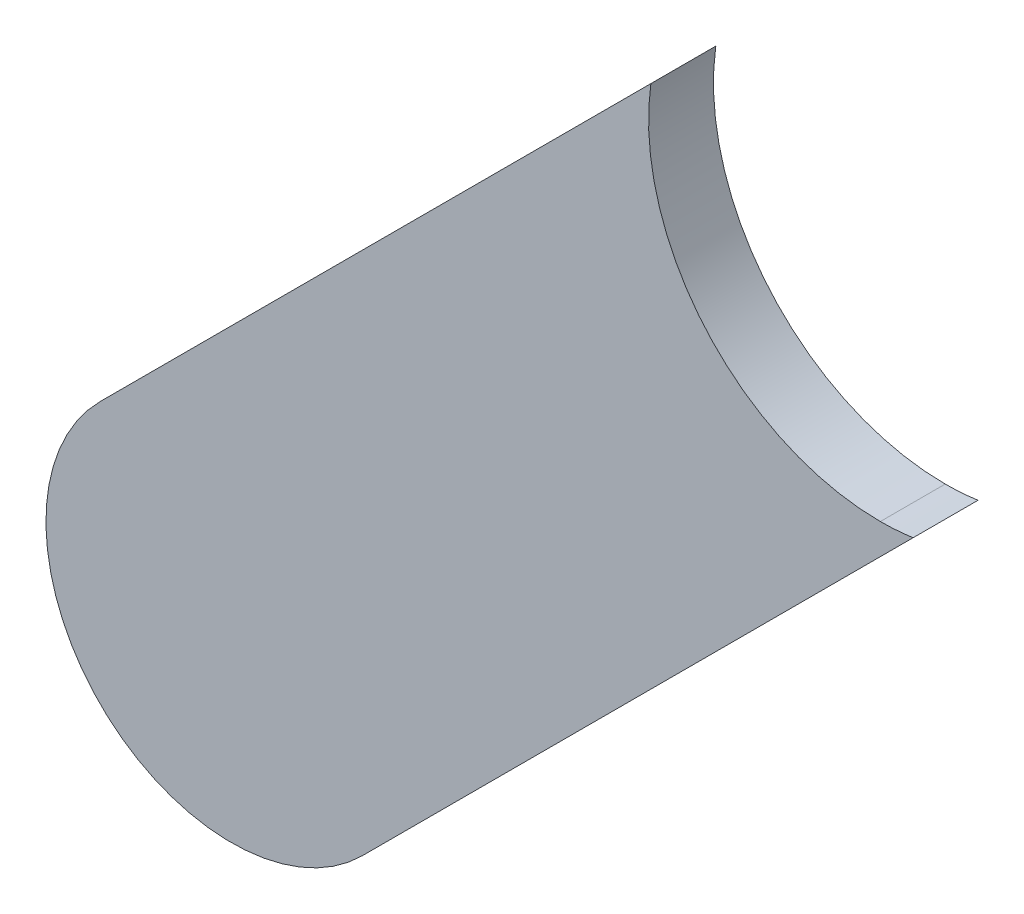
ISO-10303-21;
HEADER;
FILE_DESCRIPTION(('STEP AP214'),'2;1');
FILE_NAME('part.step','',(''),(''),'','','');
FILE_SCHEMA(('AUTOMOTIVE_DESIGN { 1 0 10303 214 1 1 1 1 }'));
ENDSEC;
DATA;
#1=APPLICATION_CONTEXT('core data for automotive mechanical design processes');
#2=APPLICATION_PROTOCOL_DEFINITION('international standard','automotive_design',2000,#1);
#3=PRODUCT_CONTEXT('',#1,'mechanical');
#4=PRODUCT('Part','Part','',(#3));
#5=PRODUCT_RELATED_PRODUCT_CATEGORY('part','',(#4));
#6=PRODUCT_DEFINITION_FORMATION('','',#4);
#7=PRODUCT_DEFINITION_CONTEXT('part definition',#1,'design');
#8=PRODUCT_DEFINITION('design','',#6,#7);
#9=PRODUCT_DEFINITION_SHAPE('','',#8);
#10=(LENGTH_UNIT() NAMED_UNIT(*) SI_UNIT(.MILLI.,.METRE.));
#11=(NAMED_UNIT(*) PLANE_ANGLE_UNIT() SI_UNIT($,.RADIAN.));
#12=(NAMED_UNIT(*) SI_UNIT($,.STERADIAN.) SOLID_ANGLE_UNIT());
#13=UNCERTAINTY_MEASURE_WITH_UNIT(LENGTH_MEASURE(1.E-05),#10,'distance_accuracy_value','');
#14=(GEOMETRIC_REPRESENTATION_CONTEXT(3) GLOBAL_UNCERTAINTY_ASSIGNED_CONTEXT((#13)) GLOBAL_UNIT_ASSIGNED_CONTEXT((#10,
#11,#12)) REPRESENTATION_CONTEXT('',''));
#15=CARTESIAN_POINT('',(0.,0.,0.));
#16=DIRECTION('',(0.,0.,1.));
#17=DIRECTION('',(1.,0.,0.));
#18=AXIS2_PLACEMENT_3D('',#15,#16,#17);
#19=CARTESIAN_POINT('',(88.2,-133.2,-0.045));
#20=DIRECTION('',(0.,0.,-1.));
#21=DIRECTION('',(0.,-1.,0.));
#22=AXIS2_PLACEMENT_3D('',#19,#20,#21);
#23=CYLINDRICAL_SURFACE('',#22,0.125);
#24=DIRECTION('',(0.,0.,1.));
#25=VECTOR('',#24,1.);
#26=CARTESIAN_POINT('',(88.2,-133.325,-0.045));
#27=LINE('',#26,#25);
#28=CARTESIAN_POINT('',(88.2,-133.325,1.6));
#29=VERTEX_POINT('',#28);
#30=CARTESIAN_POINT('',(88.2,-133.325,1.635));
#31=VERTEX_POINT('',#30);
#32=EDGE_CURVE('E115',#29,#31,#27,.T.);
#33=ORIENTED_EDGE('',*,*,#32,.F.);
#34=CARTESIAN_POINT('',(88.2,-133.2,1.6));
#35=DIRECTION('',(0.,0.,-1.));
#36=DIRECTION('',(0.,-1.,0.));
#37=AXIS2_PLACEMENT_3D('',#34,#35,#36);
#38=CIRCLE('',#37,0.125);
#39=CARTESIAN_POINT('',(88.076256420608,-133.1823215793,1.6));
#40=VERTEX_POINT('',#39);
#41=EDGE_CURVE('E85',#29,#40,#38,.T.);
#42=ORIENTED_EDGE('',*,*,#41,.T.);
#43=DIRECTION('',(0.,0.,-1.));
#44=VECTOR('',#43,1.);
#45=CARTESIAN_POINT('',(88.076256420589,-133.1823215794,-0.045));
#46=LINE('',#45,#44);
#47=CARTESIAN_POINT('',(88.076256420608,-133.1823215793,1.635));
#48=VERTEX_POINT('',#47);
#49=EDGE_CURVE('E11',#48,#40,#46,.T.);
#50=ORIENTED_EDGE('',*,*,#49,.F.);
#51=CARTESIAN_POINT('',(88.2,-133.2,1.635));
#52=DIRECTION('',(0.,0.,-1.));
#53=DIRECTION('',(0.,-1.,0.));
#54=AXIS2_PLACEMENT_3D('',#51,#52,#53);
#55=CIRCLE('',#54,0.125);
#56=EDGE_CURVE('E131',#31,#48,#55,.T.);
#57=ORIENTED_EDGE('',*,*,#56,.F.);
#58=EDGE_LOOP('',(#33,#42,#50,#57));
#59=FACE_BOUND('',#58,.T.);
#60=ADVANCED_FACE('F17',(#59),#23,.F.);
#61=CARTESIAN_POINT('',(88.129289,-133.129289,1.6));
#62=DIRECTION('',(0.707106781186548,-0.707106781186548,0.));
#63=DIRECTION('',(0.,0.,-1.));
#64=AXIS2_PLACEMENT_3D('',#61,#62,#63);
#65=PLANE('',#64);
#66=DIRECTION('',(0.,0.,1.));
#67=VECTOR('',#66,1.);
#68=CARTESIAN_POINT('',(87.779289,-133.479289,1.6));
#69=LINE('',#68,#67);
#70=CARTESIAN_POINT('',(87.779289,-133.479289,1.6));
#71=VERTEX_POINT('',#70);
#72=CARTESIAN_POINT('',(87.779289,-133.479289,1.635));
#73=VERTEX_POINT('',#72);
#74=EDGE_CURVE('E25',#71,#73,#69,.T.);
#75=ORIENTED_EDGE('',*,*,#74,.T.);
#76=DIRECTION('',(-0.707106781186548,-0.707106781186548,0.));
#77=VECTOR('',#76,1.);
#78=CARTESIAN_POINT('',(88.129289,-133.129289,1.635));
#79=LINE('',#78,#77);
#80=EDGE_CURVE('E135',#48,#73,#79,.T.);
#81=ORIENTED_EDGE('',*,*,#80,.F.);
#82=ORIENTED_EDGE('',*,*,#49,.T.);
#83=DIRECTION('',(-0.707106781186548,-0.707106781186548,0.));
#84=VECTOR('',#83,1.);
#85=CARTESIAN_POINT('',(88.129289,-133.129289,1.6));
#86=LINE('',#85,#84);
#87=EDGE_CURVE('E100',#40,#71,#86,.T.);
#88=ORIENTED_EDGE('',*,*,#87,.T.);
#89=EDGE_LOOP('',(#75,#81,#82,#88));
#90=FACE_BOUND('',#89,.T.);
#91=ADVANCED_FACE('F145',(#90),#65,.F.);
#92=CARTESIAN_POINT('',(87.8499995,-133.5499995,1.6));
#93=DIRECTION('',(0.,0.,-1.));
#94=DIRECTION('',(-0.707106781186048,0.707106781187048,0.));
#95=AXIS2_PLACEMENT_3D('',#92,#93,#94);
#96=CYLINDRICAL_SURFACE('',#95,0.09999974810218);
#97=CARTESIAN_POINT('',(87.8499995,-133.5499995,1.6));
#98=DIRECTION('',(0.,0.,1.));
#99=DIRECTION('',(-0.707106781186048,0.707106781187048,0.));
#100=AXIS2_PLACEMENT_3D('',#97,#98,#99);
#101=CIRCLE('',#100,0.09999974810218);
#102=CARTESIAN_POINT('',(87.92071,-133.62071,1.6));
#103=VERTEX_POINT('',#102);
#104=EDGE_CURVE('E90',#71,#103,#101,.T.);
#105=ORIENTED_EDGE('',*,*,#104,.T.);
#106=DIRECTION('',(0.,0.,1.));
#107=VECTOR('',#106,1.);
#108=CARTESIAN_POINT('',(87.92071,-133.62071,1.6));
#109=LINE('',#108,#107);
#110=CARTESIAN_POINT('',(87.92071,-133.62071,1.635));
#111=VERTEX_POINT('',#110);
#112=EDGE_CURVE('E98',#103,#111,#109,.T.);
#113=ORIENTED_EDGE('',*,*,#112,.T.);
#114=CARTESIAN_POINT('',(87.8499995,-133.5499995,1.635));
#115=DIRECTION('',(0.,0.,1.));
#116=DIRECTION('',(-0.707106781186048,0.707106781187048,0.));
#117=AXIS2_PLACEMENT_3D('',#114,#115,#116);
#118=CIRCLE('',#117,0.09999974810218);
#119=EDGE_CURVE('E128',#73,#111,#118,.T.);
#120=ORIENTED_EDGE('',*,*,#119,.F.);
#121=ORIENTED_EDGE('',*,*,#74,.F.);
#122=EDGE_LOOP('',(#105,#113,#120,#121));
#123=FACE_BOUND('',#122,.T.);
#124=ADVANCED_FACE('F144',(#123),#96,.T.);
#125=CARTESIAN_POINT('',(87.92071,-133.62071,1.635));
#126=DIRECTION('',(0.,0.,1.));
#127=DIRECTION('',(1.,0.,0.));
#128=AXIS2_PLACEMENT_3D('',#125,#126,#127);
#129=PLANE('',#128);
#130=ORIENTED_EDGE('',*,*,#119,.T.);
#131=DIRECTION('',(0.707106781186548,0.707106781186548,0.));
#132=VECTOR('',#131,1.);
#133=CARTESIAN_POINT('',(87.92071,-133.62071,1.635));
#134=LINE('',#133,#132);
#135=CARTESIAN_POINT('',(88.21767608728,-133.3237439127,1.635));
#136=VERTEX_POINT('',#135);
#137=EDGE_CURVE('E107',#111,#136,#134,.T.);
#138=ORIENTED_EDGE('',*,*,#137,.T.);
#139=CARTESIAN_POINT('',(88.2,-133.2,1.635));
#140=DIRECTION('',(0.,0.,-1.));
#141=DIRECTION('',(0.,-1.,0.));
#142=AXIS2_PLACEMENT_3D('',#139,#140,#141);
#143=CIRCLE('',#142,0.125);
#144=EDGE_CURVE('E104',#136,#31,#143,.T.);
#145=ORIENTED_EDGE('',*,*,#144,.T.);
#146=ORIENTED_EDGE('',*,*,#56,.T.);
#147=ORIENTED_EDGE('',*,*,#80,.T.);
#148=EDGE_LOOP('',(#130,#138,#145,#146,#147));
#149=FACE_BOUND('',#148,.T.);
#150=ADVANCED_FACE('F142',(#149),#129,.T.);
#151=CARTESIAN_POINT('',(88.2,-133.2,-0.045));
#152=DIRECTION('',(0.,0.,-1.));
#153=DIRECTION('',(0.,-1.,0.));
#154=AXIS2_PLACEMENT_3D('',#151,#152,#153);
#155=CYLINDRICAL_SURFACE('',#154,0.125);
#156=CARTESIAN_POINT('',(88.2,-133.2,1.6));
#157=DIRECTION('',(0.,0.,-1.));
#158=DIRECTION('',(0.,-1.,0.));
#159=AXIS2_PLACEMENT_3D('',#156,#157,#158);
#160=CIRCLE('',#159,0.125);
#161=CARTESIAN_POINT('',(88.21767608728,-133.3237439127,1.6));
#162=VERTEX_POINT('',#161);
#163=EDGE_CURVE('E78',#162,#29,#160,.T.);
#164=ORIENTED_EDGE('',*,*,#163,.T.);
#165=ORIENTED_EDGE('',*,*,#32,.T.);
#166=ORIENTED_EDGE('',*,*,#144,.F.);
#167=DIRECTION('',(0.,0.,-1.));
#168=VECTOR('',#167,1.);
#169=CARTESIAN_POINT('',(88.217676087265,-133.3237439127,-0.045));
#170=LINE('',#169,#168);
#171=EDGE_CURVE('E96',#136,#162,#170,.T.);
#172=ORIENTED_EDGE('',*,*,#171,.T.);
#173=EDGE_LOOP('',(#164,#165,#166,#172));
#174=FACE_BOUND('',#173,.T.);
#175=ADVANCED_FACE('F102',(#174),#155,.F.);
#176=CARTESIAN_POINT('',(87.92071,-133.62071,1.6));
#177=DIRECTION('',(0.,0.,1.));
#178=DIRECTION('',(1.,0.,0.));
#179=AXIS2_PLACEMENT_3D('',#176,#177,#178);
#180=PLANE('',#179);
#181=ORIENTED_EDGE('',*,*,#87,.F.);
#182=ORIENTED_EDGE('',*,*,#41,.F.);
#183=ORIENTED_EDGE('',*,*,#163,.F.);
#184=DIRECTION('',(0.707106781186548,0.707106781186548,0.));
#185=VECTOR('',#184,1.);
#186=CARTESIAN_POINT('',(87.92071,-133.62071,1.6));
#187=LINE('',#186,#185);
#188=EDGE_CURVE('E83',#103,#162,#187,.T.);
#189=ORIENTED_EDGE('',*,*,#188,.F.);
#190=ORIENTED_EDGE('',*,*,#104,.F.);
#191=EDGE_LOOP('',(#181,#182,#183,#189,#190));
#192=FACE_BOUND('',#191,.T.);
#193=ADVANCED_FACE('F81',(#192),#180,.F.);
#194=CARTESIAN_POINT('',(87.92071,-133.62071,1.6));
#195=DIRECTION('',(-0.707106781186548,0.707106781186548,0.));
#196=DIRECTION('',(0.,0.,1.));
#197=AXIS2_PLACEMENT_3D('',#194,#195,#196);
#198=PLANE('',#197);
#199=ORIENTED_EDGE('',*,*,#171,.F.);
#200=ORIENTED_EDGE('',*,*,#137,.F.);
#201=ORIENTED_EDGE('',*,*,#112,.F.);
#202=ORIENTED_EDGE('',*,*,#188,.T.);
#203=EDGE_LOOP('',(#199,#200,#201,#202));
#204=FACE_BOUND('',#203,.T.);
#205=ADVANCED_FACE('F94',(#204),#198,.F.);
#206=CLOSED_SHELL('',(#60,#91,#124,#150,#175,#193,#205));
#207=MANIFOLD_SOLID_BREP('B1',#206);
#208=ADVANCED_BREP_SHAPE_REPRESENTATION('',(#18,#207),#14);
#209=SHAPE_DEFINITION_REPRESENTATION(#9,#208);
ENDSEC;
END-ISO-10303-21;
